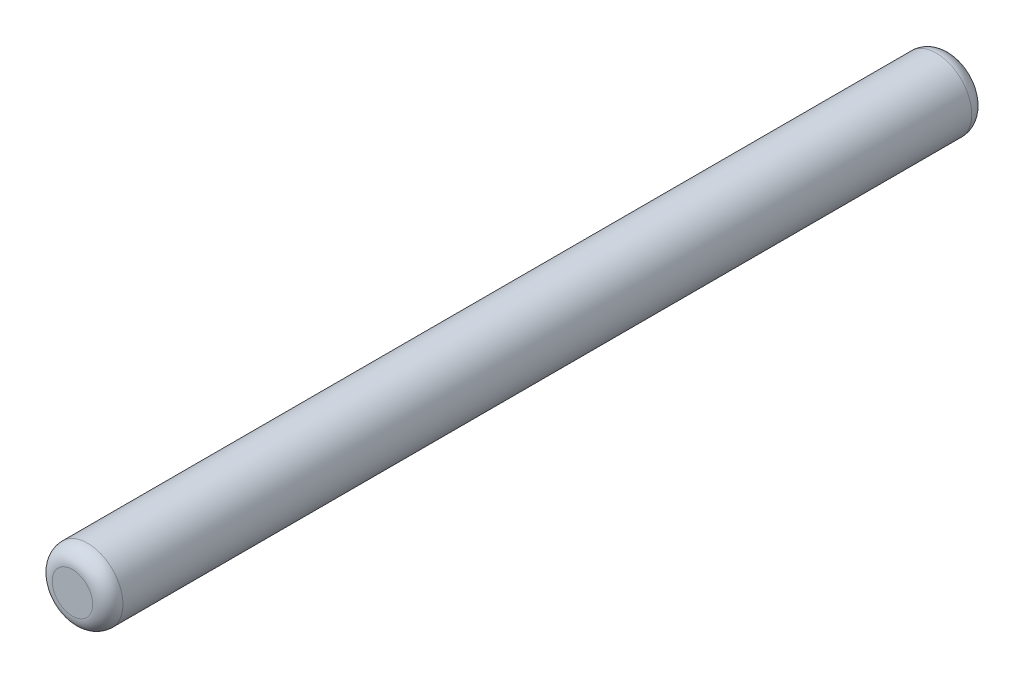
ISO-10303-21;
HEADER;
FILE_DESCRIPTION(('STEP AP214'),'2;1');
FILE_NAME('part.step','',(''),(''),'','','');
FILE_SCHEMA(('AUTOMOTIVE_DESIGN { 1 0 10303 214 1 1 1 1 }'));
ENDSEC;
DATA;
#1=APPLICATION_CONTEXT('core data for automotive mechanical design processes');
#2=APPLICATION_PROTOCOL_DEFINITION('international standard','automotive_design',2000,#1);
#3=PRODUCT_CONTEXT('',#1,'mechanical');
#4=PRODUCT('Part','Part','',(#3));
#5=PRODUCT_RELATED_PRODUCT_CATEGORY('part','',(#4));
#6=PRODUCT_DEFINITION_FORMATION('','',#4);
#7=PRODUCT_DEFINITION_CONTEXT('part definition',#1,'design');
#8=PRODUCT_DEFINITION('design','',#6,#7);
#9=PRODUCT_DEFINITION_SHAPE('','',#8);
#10=(LENGTH_UNIT() NAMED_UNIT(*) SI_UNIT(.MILLI.,.METRE.));
#11=(NAMED_UNIT(*) PLANE_ANGLE_UNIT() SI_UNIT($,.RADIAN.));
#12=(NAMED_UNIT(*) SI_UNIT($,.STERADIAN.) SOLID_ANGLE_UNIT());
#13=UNCERTAINTY_MEASURE_WITH_UNIT(LENGTH_MEASURE(1.E-05),#10,'distance_accuracy_value','');
#14=(GEOMETRIC_REPRESENTATION_CONTEXT(3) GLOBAL_UNCERTAINTY_ASSIGNED_CONTEXT((#13)) GLOBAL_UNIT_ASSIGNED_CONTEXT((#10,
#11,#12)) REPRESENTATION_CONTEXT('',''));
#15=CARTESIAN_POINT('',(0.,0.,0.));
#16=DIRECTION('',(0.,0.,1.));
#17=DIRECTION('',(1.,0.,0.));
#18=AXIS2_PLACEMENT_3D('',#15,#16,#17);
#19=CARTESIAN_POINT('',(4.8,1.85,-5.5));
#20=DIRECTION('',(0.,0.,1.));
#21=DIRECTION('',(1.,0.,0.));
#22=AXIS2_PLACEMENT_3D('',#19,#20,#21);
#23=PLANE('',#22);
#24=CARTESIAN_POINT('',(4.8,1.85,-5.5));
#25=DIRECTION('',(0.,0.,1.));
#26=DIRECTION('',(1.,0.,0.));
#27=AXIS2_PLACEMENT_3D('',#24,#25,#26);
#28=CIRCLE('',#27,0.2);
#29=CARTESIAN_POINT('',(5.,1.85,-5.5));
#30=VERTEX_POINT('',#29);
#31=EDGE_CURVE('E20',#30,#30,#28,.T.);
#32=ORIENTED_EDGE('',*,*,#31,.F.);
#33=EDGE_LOOP('',(#32));
#34=FACE_BOUND('',#33,.T.);
#35=ADVANCED_FACE('F17',(#34),#23,.F.);
#36=CARTESIAN_POINT('',(4.8,1.85,-5.35));
#37=DIRECTION('',(0.,0.,-1.));
#38=DIRECTION('',(-1.,0.,0.));
#39=AXIS2_PLACEMENT_3D('',#36,#37,#38);
#40=TOROIDAL_SURFACE('',#39,0.2,0.15);
#41=ORIENTED_EDGE('',*,*,#31,.T.);
#42=CARTESIAN_POINT('',(5.,1.85,-5.35));
#43=DIRECTION('',(0.,-1.,0.));
#44=DIRECTION('',(1.,0.,0.));
#45=AXIS2_PLACEMENT_3D('',#42,#43,#44);
#46=CIRCLE('',#45,0.15);
#47=CARTESIAN_POINT('',(5.15,1.85,-5.35));
#48=VERTEX_POINT('',#47);
#49=EDGE_CURVE('E11',#30,#48,#46,.T.);
#50=ORIENTED_EDGE('',*,*,#49,.T.);
#51=CARTESIAN_POINT('',(4.8,1.85,-5.35));
#52=DIRECTION('',(0.,0.,-1.));
#53=DIRECTION('',(1.,0.,0.));
#54=AXIS2_PLACEMENT_3D('',#51,#52,#53);
#55=CIRCLE('',#54,0.35);
#56=CARTESIAN_POINT('',(4.45,1.85,-5.35));
#57=VERTEX_POINT('',#56);
#58=EDGE_CURVE('E72',#48,#57,#55,.T.);
#59=ORIENTED_EDGE('',*,*,#58,.T.);
#60=CARTESIAN_POINT('',(4.8,1.85,-5.35));
#61=DIRECTION('',(0.,0.,-1.));
#62=DIRECTION('',(1.,0.,0.));
#63=AXIS2_PLACEMENT_3D('',#60,#61,#62);
#64=CIRCLE('',#63,0.35);
#65=EDGE_CURVE('E69',#57,#48,#64,.T.);
#66=ORIENTED_EDGE('',*,*,#65,.T.);
#67=ORIENTED_EDGE('',*,*,#49,.F.);
#68=EDGE_LOOP('',(#41,#50,#59,#66,#67));
#69=FACE_BOUND('',#68,.T.);
#70=ADVANCED_FACE('F88',(#69),#40,.T.);
#71=CARTESIAN_POINT('',(4.8,1.85,3.2));
#72=DIRECTION('',(0.,0.,1.));
#73=DIRECTION('',(1.,0.,0.));
#74=AXIS2_PLACEMENT_3D('',#71,#72,#73);
#75=PLANE('',#74);
#76=CARTESIAN_POINT('',(4.8,1.85,3.2));
#77=DIRECTION('',(0.,0.,-1.));
#78=DIRECTION('',(1.,0.,0.));
#79=AXIS2_PLACEMENT_3D('',#76,#77,#78);
#80=CIRCLE('',#79,0.2);
#81=CARTESIAN_POINT('',(4.6,1.85,3.2));
#82=VERTEX_POINT('',#81);
#83=EDGE_CURVE('E58',#82,#82,#80,.T.);
#84=ORIENTED_EDGE('',*,*,#83,.F.);
#85=EDGE_LOOP('',(#84));
#86=FACE_BOUND('',#85,.T.);
#87=ADVANCED_FACE('F90',(#86),#75,.T.);
#88=CARTESIAN_POINT('',(4.8,1.85,0.));
#89=DIRECTION('',(0.,0.,-1.));
#90=DIRECTION('',(1.,0.,0.));
#91=AXIS2_PLACEMENT_3D('',#88,#89,#90);
#92=CYLINDRICAL_SURFACE('',#91,0.35);
#93=ORIENTED_EDGE('',*,*,#65,.F.);
#94=DIRECTION('',(0.,0.,1.));
#95=VECTOR('',#94,1.);
#96=CARTESIAN_POINT('',(4.45,1.85,0.));
#97=LINE('',#96,#95);
#98=CARTESIAN_POINT('',(4.45,1.85,3.05));
#99=VERTEX_POINT('',#98);
#100=EDGE_CURVE('E76',#57,#99,#97,.T.);
#101=ORIENTED_EDGE('',*,*,#100,.T.);
#102=CARTESIAN_POINT('',(4.8,1.85,3.05));
#103=DIRECTION('',(0.,0.,1.));
#104=DIRECTION('',(1.,0.,0.));
#105=AXIS2_PLACEMENT_3D('',#102,#103,#104);
#106=CIRCLE('',#105,0.35);
#107=EDGE_CURVE('E62',#99,#99,#106,.T.);
#108=ORIENTED_EDGE('',*,*,#107,.F.);
#109=ORIENTED_EDGE('',*,*,#100,.F.);
#110=ORIENTED_EDGE('',*,*,#58,.F.);
#111=EDGE_LOOP('',(#93,#101,#108,#109,#110));
#112=FACE_BOUND('',#111,.T.);
#113=ADVANCED_FACE('F83',(#112),#92,.T.);
#114=CARTESIAN_POINT('',(4.8,1.85,3.05));
#115=DIRECTION('',(0.,0.,1.));
#116=DIRECTION('',(1.,0.,0.));
#117=AXIS2_PLACEMENT_3D('',#114,#115,#116);
#118=TOROIDAL_SURFACE('',#117,0.2,0.15);
#119=ORIENTED_EDGE('',*,*,#83,.T.);
#120=CARTESIAN_POINT('',(4.6,1.85,3.05));
#121=DIRECTION('',(0.,-1.,0.));
#122=DIRECTION('',(-1.,0.,0.));
#123=AXIS2_PLACEMENT_3D('',#120,#121,#122);
#124=CIRCLE('',#123,0.15);
#125=EDGE_CURVE('E60',#82,#99,#124,.T.);
#126=ORIENTED_EDGE('',*,*,#125,.T.);
#127=ORIENTED_EDGE('',*,*,#107,.T.);
#128=ORIENTED_EDGE('',*,*,#125,.F.);
#129=EDGE_LOOP('',(#119,#126,#127,#128));
#130=FACE_BOUND('',#129,.T.);
#131=ADVANCED_FACE('F59',(#130),#118,.T.);
#132=CLOSED_SHELL('',(#35,#70,#87,#113,#131));
#133=MANIFOLD_SOLID_BREP('B1',#132);
#134=ADVANCED_BREP_SHAPE_REPRESENTATION('',(#18,#133),#14);
#135=SHAPE_DEFINITION_REPRESENTATION(#9,#134);
ENDSEC;
END-ISO-10303-21;
